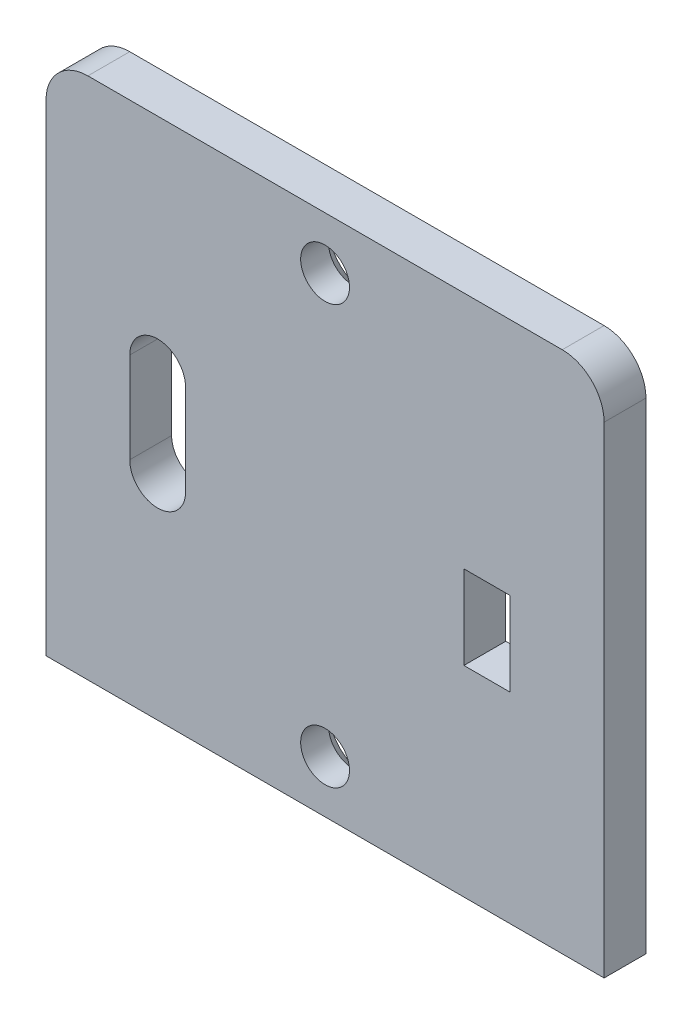
ISO-10303-21;
HEADER;
FILE_DESCRIPTION(('STEP AP214'),'2;1');
FILE_NAME('part.step','',(''),(''),'','','');
FILE_SCHEMA(('AUTOMOTIVE_DESIGN { 1 0 10303 214 1 1 1 1 }'));
ENDSEC;
DATA;
#1=APPLICATION_CONTEXT('core data for automotive mechanical design processes');
#2=APPLICATION_PROTOCOL_DEFINITION('international standard','automotive_design',2000,#1);
#3=PRODUCT_CONTEXT('',#1,'mechanical');
#4=PRODUCT('Part','Part','',(#3));
#5=PRODUCT_RELATED_PRODUCT_CATEGORY('part','',(#4));
#6=PRODUCT_DEFINITION_FORMATION('','',#4);
#7=PRODUCT_DEFINITION_CONTEXT('part definition',#1,'design');
#8=PRODUCT_DEFINITION('design','',#6,#7);
#9=PRODUCT_DEFINITION_SHAPE('','',#8);
#10=(LENGTH_UNIT() NAMED_UNIT(*) SI_UNIT(.MILLI.,.METRE.));
#11=(NAMED_UNIT(*) PLANE_ANGLE_UNIT() SI_UNIT($,.RADIAN.));
#12=(NAMED_UNIT(*) SI_UNIT($,.STERADIAN.) SOLID_ANGLE_UNIT());
#13=UNCERTAINTY_MEASURE_WITH_UNIT(LENGTH_MEASURE(1.E-05),#10,'distance_accuracy_value','');
#14=(GEOMETRIC_REPRESENTATION_CONTEXT(3) GLOBAL_UNCERTAINTY_ASSIGNED_CONTEXT((#13)) GLOBAL_UNIT_ASSIGNED_CONTEXT((#10,
#11,#12)) REPRESENTATION_CONTEXT('',''));
#15=CARTESIAN_POINT('',(0.,0.,0.));
#16=DIRECTION('',(0.,0.,1.));
#17=DIRECTION('',(1.,0.,0.));
#18=AXIS2_PLACEMENT_3D('',#15,#16,#17);
#19=CARTESIAN_POINT('',(0.,0.,3.));
#20=DIRECTION('',(0.,0.,1.));
#21=DIRECTION('',(1.,0.,0.));
#22=AXIS2_PLACEMENT_3D('',#19,#20,#21);
#23=PLANE('',#22);
#24=CARTESIAN_POINT('',(-22.738255033557,11.4519818661245,3.));
#25=DIRECTION('',(0.,0.,-1.));
#26=DIRECTION('',(-1.,0.,0.));
#27=AXIS2_PLACEMENT_3D('',#24,#25,#26);
#28=CIRCLE('',#27,2.);
#29=CARTESIAN_POINT('',(-24.738255033557,11.4519818661245,3.));
#30=VERTEX_POINT('',#29);
#31=CARTESIAN_POINT('',(-20.738255033557,11.4519818661245,3.));
#32=VERTEX_POINT('',#31);
#33=EDGE_CURVE('E144',#30,#32,#28,.T.);
#34=ORIENTED_EDGE('',*,*,#33,.T.);
#35=DIRECTION('',(0.,-1.,0.));
#36=VECTOR('',#35,1.);
#37=CARTESIAN_POINT('',(-20.738255033557,11.4519818661245,3.));
#38=LINE('',#37,#36);
#39=CARTESIAN_POINT('',(-20.738255033557,4.95198186612454,3.));
#40=VERTEX_POINT('',#39);
#41=EDGE_CURVE('E155',#32,#40,#38,.T.);
#42=ORIENTED_EDGE('',*,*,#41,.T.);
#43=CARTESIAN_POINT('',(-22.738255033557,4.95198186612454,3.));
#44=DIRECTION('',(0.,0.,-1.));
#45=DIRECTION('',(-1.,0.,0.));
#46=AXIS2_PLACEMENT_3D('',#43,#44,#45);
#47=CIRCLE('',#46,2.);
#48=CARTESIAN_POINT('',(-24.738255033557,4.95198186612454,3.));
#49=VERTEX_POINT('',#48);
#50=EDGE_CURVE('E54',#40,#49,#47,.T.);
#51=ORIENTED_EDGE('',*,*,#50,.T.);
#52=DIRECTION('',(0.,1.,0.));
#53=VECTOR('',#52,1.);
#54=CARTESIAN_POINT('',(-24.738255033557,11.4519818661245,3.));
#55=LINE('',#54,#53);
#56=EDGE_CURVE('E152',#49,#30,#55,.T.);
#57=ORIENTED_EDGE('',*,*,#56,.T.);
#58=EDGE_LOOP('',(#34,#42,#51,#57));
#59=FACE_BOUND('',#58,.T.);
#60=DIRECTION('',(0.,-1.,0.));
#61=VECTOR('',#60,1.);
#62=CARTESIAN_POINT('',(2.5106810935728,10.1581158120587,3.));
#63=LINE('',#62,#61);
#64=CARTESIAN_POINT('',(2.5106810935728,10.1581158120587,3.));
#65=VERTEX_POINT('',#64);
#66=CARTESIAN_POINT('',(2.5106810935728,4.15811581205871,3.));
#67=VERTEX_POINT('',#66);
#68=EDGE_CURVE('E198',#65,#67,#63,.T.);
#69=ORIENTED_EDGE('',*,*,#68,.T.);
#70=DIRECTION('',(-1.,0.,0.));
#71=VECTOR('',#70,1.);
#72=CARTESIAN_POINT('',(2.5106810935728,4.15811581205871,3.));
#73=LINE('',#72,#71);
#74=CARTESIAN_POINT('',(-0.789318906427197,4.15811581205871,3.));
#75=VERTEX_POINT('',#74);
#76=EDGE_CURVE('E208',#67,#75,#73,.T.);
#77=ORIENTED_EDGE('',*,*,#76,.T.);
#78=DIRECTION('',(0.,1.,0.));
#79=VECTOR('',#78,1.);
#80=CARTESIAN_POINT('',(-0.789318906427196,10.1581158120587,3.));
#81=LINE('',#80,#79);
#82=CARTESIAN_POINT('',(-0.789318906427196,10.1581158120587,3.));
#83=VERTEX_POINT('',#82);
#84=EDGE_CURVE('E62',#75,#83,#81,.T.);
#85=ORIENTED_EDGE('',*,*,#84,.T.);
#86=DIRECTION('',(1.,0.,0.));
#87=VECTOR('',#86,1.);
#88=CARTESIAN_POINT('',(2.5106810935728,10.1581158120587,3.));
#89=LINE('',#88,#87);
#90=EDGE_CURVE('E187',#83,#65,#89,.T.);
#91=ORIENTED_EDGE('',*,*,#90,.T.);
#92=EDGE_LOOP('',(#69,#77,#85,#91));
#93=FACE_BOUND('',#92,.T.);
#94=CARTESIAN_POINT('',(-10.738255033557,-6.46812080536913,3.));
#95=DIRECTION('',(0.,0.,1.));
#96=DIRECTION('',(1.,0.,0.));
#97=AXIS2_PLACEMENT_3D('',#94,#95,#96);
#98=CIRCLE('',#97,1.75);
#99=CARTESIAN_POINT('',(-8.98825503355705,-6.46812080536913,3.));
#100=VERTEX_POINT('',#99);
#101=EDGE_CURVE('E215',#100,#100,#98,.T.);
#102=ORIENTED_EDGE('',*,*,#101,.F.);
#103=EDGE_LOOP('',(#102));
#104=FACE_BOUND('',#103,.T.);
#105=DIRECTION('',(-1.,0.,0.));
#106=VECTOR('',#105,1.);
#107=CARTESIAN_POINT('',(-30.738255033557,27.2818791946309,3.));
#108=LINE('',#107,#106);
#109=CARTESIAN_POINT('',(6.26174496644295,27.2818791946309,3.));
#110=VERTEX_POINT('',#109);
#111=CARTESIAN_POINT('',(-27.738255033557,27.2818791946309,3.));
#112=VERTEX_POINT('',#111);
#113=EDGE_CURVE('E222',#110,#112,#108,.T.);
#114=ORIENTED_EDGE('',*,*,#113,.T.);
#115=CARTESIAN_POINT('',(-27.738255033557,24.2818791946309,3.));
#116=DIRECTION('',(0.,0.,1.));
#117=DIRECTION('',(1.,0.,0.));
#118=AXIS2_PLACEMENT_3D('',#115,#116,#117);
#119=CIRCLE('',#118,3.);
#120=CARTESIAN_POINT('',(-30.738255033557,24.2818791946309,3.));
#121=VERTEX_POINT('',#120);
#122=EDGE_CURVE('E270',#112,#121,#119,.T.);
#123=ORIENTED_EDGE('',*,*,#122,.T.);
#124=DIRECTION('',(0.,-1.,0.));
#125=VECTOR('',#124,1.);
#126=CARTESIAN_POINT('',(-30.738255033557,27.2818791946309,3.));
#127=LINE('',#126,#125);
#128=CARTESIAN_POINT('',(-30.738255033557,-10.2181208053691,3.));
#129=VERTEX_POINT('',#128);
#130=EDGE_CURVE('E226',#121,#129,#127,.T.);
#131=ORIENTED_EDGE('',*,*,#130,.T.);
#132=DIRECTION('',(1.,0.,0.));
#133=VECTOR('',#132,1.);
#134=CARTESIAN_POINT('',(-30.738255033557,-10.2181208053691,3.));
#135=LINE('',#134,#133);
#136=CARTESIAN_POINT('',(9.26174496644296,-10.2181208053691,3.));
#137=VERTEX_POINT('',#136);
#138=EDGE_CURVE('E228',#129,#137,#135,.T.);
#139=ORIENTED_EDGE('',*,*,#138,.T.);
#140=DIRECTION('',(0.,1.,0.));
#141=VECTOR('',#140,1.);
#142=CARTESIAN_POINT('',(9.26174496644295,27.2818791946309,3.));
#143=LINE('',#142,#141);
#144=CARTESIAN_POINT('',(9.26174496644295,24.2818791946309,3.));
#145=VERTEX_POINT('',#144);
#146=EDGE_CURVE('E219',#137,#145,#143,.T.);
#147=ORIENTED_EDGE('',*,*,#146,.T.);
#148=CARTESIAN_POINT('',(6.26174496644295,24.2818791946309,3.));
#149=DIRECTION('',(0.,0.,1.));
#150=DIRECTION('',(1.,0.,0.));
#151=AXIS2_PLACEMENT_3D('',#148,#149,#150);
#152=CIRCLE('',#151,3.);
#153=EDGE_CURVE('E268',#145,#110,#152,.T.);
#154=ORIENTED_EDGE('',*,*,#153,.T.);
#155=EDGE_LOOP('',(#114,#123,#131,#139,#147,#154));
#156=FACE_BOUND('',#155,.T.);
#157=CARTESIAN_POINT('',(-10.738255033557,23.5318791946309,3.));
#158=DIRECTION('',(0.,0.,1.));
#159=DIRECTION('',(1.,0.,0.));
#160=AXIS2_PLACEMENT_3D('',#157,#158,#159);
#161=CIRCLE('',#160,1.75);
#162=CARTESIAN_POINT('',(-8.98825503355705,23.5318791946309,3.));
#163=VERTEX_POINT('',#162);
#164=EDGE_CURVE('E180',#163,#163,#161,.T.);
#165=ORIENTED_EDGE('',*,*,#164,.F.);
#166=EDGE_LOOP('',(#165));
#167=FACE_BOUND('',#166,.T.);
#168=ADVANCED_FACE('F39',(#59,#93,#104,#156,#167),#23,.T.);
#169=CARTESIAN_POINT('',(0.,0.,0.));
#170=DIRECTION('',(0.,0.,1.));
#171=DIRECTION('',(1.,0.,0.));
#172=AXIS2_PLACEMENT_3D('',#169,#170,#171);
#173=PLANE('',#172);
#174=CARTESIAN_POINT('',(0.860681093572804,15.1581158120587,0.));
#175=DIRECTION('',(0.,0.,1.));
#176=DIRECTION('',(1.,0.,0.));
#177=AXIS2_PLACEMENT_3D('',#174,#175,#176);
#178=CIRCLE('',#177,1.);
#179=CARTESIAN_POINT('',(1.8606810935728,15.1581158120587,0.));
#180=VERTEX_POINT('',#179);
#181=EDGE_CURVE('E11',#180,#180,#178,.F.);
#182=ORIENTED_EDGE('',*,*,#181,.F.);
#183=EDGE_LOOP('',(#182));
#184=FACE_BOUND('',#183,.T.);
#185=CARTESIAN_POINT('',(0.860681093572802,-0.841884187941289,0.));
#186=DIRECTION('',(0.,0.,1.));
#187=DIRECTION('',(1.,0.,0.));
#188=AXIS2_PLACEMENT_3D('',#185,#186,#187);
#189=CIRCLE('',#188,1.);
#190=CARTESIAN_POINT('',(1.8606810935728,-0.841884187941289,0.));
#191=VERTEX_POINT('',#190);
#192=EDGE_CURVE('E47',#191,#191,#189,.F.);
#193=ORIENTED_EDGE('',*,*,#192,.F.);
#194=EDGE_LOOP('',(#193));
#195=FACE_BOUND('',#194,.T.);
#196=DIRECTION('',(0.,-1.,0.));
#197=VECTOR('',#196,1.);
#198=CARTESIAN_POINT('',(-20.738255033557,11.4519818661245,0.));
#199=LINE('',#198,#197);
#200=CARTESIAN_POINT('',(-20.738255033557,11.4519818661245,0.));
#201=VERTEX_POINT('',#200);
#202=CARTESIAN_POINT('',(-20.738255033557,4.95198186612454,0.));
#203=VERTEX_POINT('',#202);
#204=EDGE_CURVE('E173',#201,#203,#199,.T.);
#205=ORIENTED_EDGE('',*,*,#204,.F.);
#206=CARTESIAN_POINT('',(-22.738255033557,11.4519818661245,0.));
#207=DIRECTION('',(0.,0.,-1.));
#208=DIRECTION('',(-1.,0.,0.));
#209=AXIS2_PLACEMENT_3D('',#206,#207,#208);
#210=CIRCLE('',#209,2.);
#211=CARTESIAN_POINT('',(-24.738255033557,11.4519818661245,0.));
#212=VERTEX_POINT('',#211);
#213=EDGE_CURVE('E147',#212,#201,#210,.T.);
#214=ORIENTED_EDGE('',*,*,#213,.F.);
#215=DIRECTION('',(0.,1.,0.));
#216=VECTOR('',#215,1.);
#217=CARTESIAN_POINT('',(-24.738255033557,11.4519818661245,0.));
#218=LINE('',#217,#216);
#219=CARTESIAN_POINT('',(-24.738255033557,4.95198186612454,0.));
#220=VERTEX_POINT('',#219);
#221=EDGE_CURVE('E161',#220,#212,#218,.T.);
#222=ORIENTED_EDGE('',*,*,#221,.F.);
#223=CARTESIAN_POINT('',(-22.738255033557,4.95198186612454,0.));
#224=DIRECTION('',(0.,0.,-1.));
#225=DIRECTION('',(-1.,0.,0.));
#226=AXIS2_PLACEMENT_3D('',#223,#224,#225);
#227=CIRCLE('',#226,2.);
#228=EDGE_CURVE('E164',#203,#220,#227,.T.);
#229=ORIENTED_EDGE('',*,*,#228,.F.);
#230=EDGE_LOOP('',(#205,#214,#222,#229));
#231=FACE_BOUND('',#230,.T.);
#232=DIRECTION('',(-1.,0.,0.));
#233=VECTOR('',#232,1.);
#234=CARTESIAN_POINT('',(2.5106810935728,4.15811581205871,0.));
#235=LINE('',#234,#233);
#236=CARTESIAN_POINT('',(2.5106810935728,4.15811581205871,0.));
#237=VERTEX_POINT('',#236);
#238=CARTESIAN_POINT('',(-0.789318906427197,4.15811581205871,0.));
#239=VERTEX_POINT('',#238);
#240=EDGE_CURVE('E201',#237,#239,#235,.T.);
#241=ORIENTED_EDGE('',*,*,#240,.F.);
#242=DIRECTION('',(0.,-1.,0.));
#243=VECTOR('',#242,1.);
#244=CARTESIAN_POINT('',(2.5106810935728,10.1581158120587,0.));
#245=LINE('',#244,#243);
#246=CARTESIAN_POINT('',(2.5106810935728,10.1581158120587,0.));
#247=VERTEX_POINT('',#246);
#248=EDGE_CURVE('E174',#247,#237,#245,.T.);
#249=ORIENTED_EDGE('',*,*,#248,.F.);
#250=DIRECTION('',(1.,0.,0.));
#251=VECTOR('',#250,1.);
#252=CARTESIAN_POINT('',(2.5106810935728,10.1581158120587,0.));
#253=LINE('',#252,#251);
#254=CARTESIAN_POINT('',(-0.789318906427196,10.1581158120587,0.));
#255=VERTEX_POINT('',#254);
#256=EDGE_CURVE('E194',#255,#247,#253,.T.);
#257=ORIENTED_EDGE('',*,*,#256,.F.);
#258=DIRECTION('',(0.,1.,0.));
#259=VECTOR('',#258,1.);
#260=CARTESIAN_POINT('',(-0.789318906427196,10.1581158120587,0.));
#261=LINE('',#260,#259);
#262=EDGE_CURVE('E197',#239,#255,#261,.T.);
#263=ORIENTED_EDGE('',*,*,#262,.F.);
#264=EDGE_LOOP('',(#241,#249,#257,#263));
#265=FACE_BOUND('',#264,.T.);
#266=CARTESIAN_POINT('',(-10.738255033557,-6.46812080536913,0.));
#267=DIRECTION('',(0.,0.,1.));
#268=DIRECTION('',(1.,0.,0.));
#269=AXIS2_PLACEMENT_3D('',#266,#267,#268);
#270=CIRCLE('',#269,2.75);
#271=CARTESIAN_POINT('',(-7.98825503355705,-6.46812080536913,0.));
#272=VERTEX_POINT('',#271);
#273=EDGE_CURVE('E247',#272,#272,#270,.T.);
#274=ORIENTED_EDGE('',*,*,#273,.T.);
#275=EDGE_LOOP('',(#274));
#276=FACE_BOUND('',#275,.T.);
#277=CARTESIAN_POINT('',(-10.738255033557,23.5318791946309,0.));
#278=DIRECTION('',(0.,0.,1.));
#279=DIRECTION('',(1.,0.,0.));
#280=AXIS2_PLACEMENT_3D('',#277,#278,#279);
#281=CIRCLE('',#280,2.75);
#282=CARTESIAN_POINT('',(-7.98825503355705,23.5318791946309,0.));
#283=VERTEX_POINT('',#282);
#284=EDGE_CURVE('E244',#283,#283,#281,.T.);
#285=ORIENTED_EDGE('',*,*,#284,.T.);
#286=EDGE_LOOP('',(#285));
#287=FACE_BOUND('',#286,.T.);
#288=DIRECTION('',(0.,-1.,0.));
#289=VECTOR('',#288,1.);
#290=CARTESIAN_POINT('',(-30.738255033557,27.2818791946309,0.));
#291=LINE('',#290,#289);
#292=CARTESIAN_POINT('',(-30.738255033557,24.2818791946309,0.));
#293=VERTEX_POINT('',#292);
#294=CARTESIAN_POINT('',(-30.738255033557,-10.2181208053691,0.));
#295=VERTEX_POINT('',#294);
#296=EDGE_CURVE('E236',#293,#295,#291,.T.);
#297=ORIENTED_EDGE('',*,*,#296,.F.);
#298=CARTESIAN_POINT('',(-27.738255033557,24.2818791946309,0.));
#299=DIRECTION('',(0.,0.,1.));
#300=DIRECTION('',(1.,0.,0.));
#301=AXIS2_PLACEMENT_3D('',#298,#299,#300);
#302=CIRCLE('',#301,3.);
#303=CARTESIAN_POINT('',(-27.738255033557,27.2818791946309,0.));
#304=VERTEX_POINT('',#303);
#305=EDGE_CURVE('E261',#293,#304,#302,.F.);
#306=ORIENTED_EDGE('',*,*,#305,.T.);
#307=DIRECTION('',(-1.,0.,0.));
#308=VECTOR('',#307,1.);
#309=CARTESIAN_POINT('',(-30.738255033557,27.2818791946309,0.));
#310=LINE('',#309,#308);
#311=CARTESIAN_POINT('',(6.26174496644295,27.2818791946309,0.));
#312=VERTEX_POINT('',#311);
#313=EDGE_CURVE('E233',#312,#304,#310,.T.);
#314=ORIENTED_EDGE('',*,*,#313,.F.);
#315=CARTESIAN_POINT('',(6.26174496644295,24.2818791946309,0.));
#316=DIRECTION('',(0.,0.,1.));
#317=DIRECTION('',(1.,0.,0.));
#318=AXIS2_PLACEMENT_3D('',#315,#316,#317);
#319=CIRCLE('',#318,3.);
#320=CARTESIAN_POINT('',(9.26174496644295,24.2818791946309,0.));
#321=VERTEX_POINT('',#320);
#322=EDGE_CURVE('E259',#312,#321,#319,.F.);
#323=ORIENTED_EDGE('',*,*,#322,.T.);
#324=DIRECTION('',(0.,1.,0.));
#325=VECTOR('',#324,1.);
#326=CARTESIAN_POINT('',(9.26174496644295,27.2818791946309,0.));
#327=LINE('',#326,#325);
#328=CARTESIAN_POINT('',(9.26174496644296,-10.2181208053691,0.));
#329=VERTEX_POINT('',#328);
#330=EDGE_CURVE('E218',#329,#321,#327,.T.);
#331=ORIENTED_EDGE('',*,*,#330,.F.);
#332=DIRECTION('',(1.,0.,0.));
#333=VECTOR('',#332,1.);
#334=CARTESIAN_POINT('',(-30.738255033557,-10.2181208053691,0.));
#335=LINE('',#334,#333);
#336=EDGE_CURVE('E223',#295,#329,#335,.T.);
#337=ORIENTED_EDGE('',*,*,#336,.F.);
#338=EDGE_LOOP('',(#297,#306,#314,#323,#331,#337));
#339=FACE_BOUND('',#338,.T.);
#340=ADVANCED_FACE('F278',(#184,#195,#231,#265,#276,#287,#339),#173,.F.);
#341=CARTESIAN_POINT('',(9.26174496644295,27.2818791946309,3.));
#342=DIRECTION('',(-1.,0.,0.));
#343=DIRECTION('',(0.,-1.,0.));
#344=AXIS2_PLACEMENT_3D('',#341,#342,#343);
#345=PLANE('',#344);
#346=ORIENTED_EDGE('',*,*,#330,.T.);
#347=DIRECTION('',(0.,0.,-1.));
#348=VECTOR('',#347,1.);
#349=CARTESIAN_POINT('',(9.26174496644295,24.2818791946309,3.));
#350=LINE('',#349,#348);
#351=EDGE_CURVE('E272',#321,#145,#350,.F.);
#352=ORIENTED_EDGE('',*,*,#351,.T.);
#353=ORIENTED_EDGE('',*,*,#146,.F.);
#354=DIRECTION('',(0.,0.,-1.));
#355=VECTOR('',#354,1.);
#356=CARTESIAN_POINT('',(9.26174496644296,-10.2181208053691,3.));
#357=LINE('',#356,#355);
#358=EDGE_CURVE('E230',#137,#329,#357,.T.);
#359=ORIENTED_EDGE('',*,*,#358,.T.);
#360=EDGE_LOOP('',(#346,#352,#353,#359));
#361=FACE_BOUND('',#360,.T.);
#362=ADVANCED_FACE('F281',(#361),#345,.F.);
#363=CARTESIAN_POINT('',(-30.738255033557,27.2818791946309,3.));
#364=DIRECTION('',(0.,-1.,0.));
#365=DIRECTION('',(0.,0.,-1.));
#366=AXIS2_PLACEMENT_3D('',#363,#364,#365);
#367=PLANE('',#366);
#368=ORIENTED_EDGE('',*,*,#313,.T.);
#369=DIRECTION('',(0.,0.,-1.));
#370=VECTOR('',#369,1.);
#371=CARTESIAN_POINT('',(-27.738255033557,27.2818791946309,3.));
#372=LINE('',#371,#370);
#373=EDGE_CURVE('E266',#304,#112,#372,.F.);
#374=ORIENTED_EDGE('',*,*,#373,.T.);
#375=ORIENTED_EDGE('',*,*,#113,.F.);
#376=DIRECTION('',(0.,0.,-1.));
#377=VECTOR('',#376,1.);
#378=CARTESIAN_POINT('',(6.26174496644295,27.2818791946309,3.));
#379=LINE('',#378,#377);
#380=EDGE_CURVE('E263',#110,#312,#379,.T.);
#381=ORIENTED_EDGE('',*,*,#380,.T.);
#382=EDGE_LOOP('',(#368,#374,#375,#381));
#383=FACE_BOUND('',#382,.T.);
#384=ADVANCED_FACE('F317',(#383),#367,.F.);
#385=CARTESIAN_POINT('',(-30.738255033557,27.2818791946309,3.));
#386=DIRECTION('',(1.,0.,0.));
#387=DIRECTION('',(0.,0.,-1.));
#388=AXIS2_PLACEMENT_3D('',#385,#386,#387);
#389=PLANE('',#388);
#390=ORIENTED_EDGE('',*,*,#130,.F.);
#391=DIRECTION('',(0.,0.,-1.));
#392=VECTOR('',#391,1.);
#393=CARTESIAN_POINT('',(-30.738255033557,24.2818791946309,3.));
#394=LINE('',#393,#392);
#395=EDGE_CURVE('E256',#121,#293,#394,.T.);
#396=ORIENTED_EDGE('',*,*,#395,.T.);
#397=ORIENTED_EDGE('',*,*,#296,.T.);
#398=DIRECTION('',(0.,0.,-1.));
#399=VECTOR('',#398,1.);
#400=CARTESIAN_POINT('',(-30.738255033557,-10.2181208053691,3.));
#401=LINE('',#400,#399);
#402=EDGE_CURVE('E241',#129,#295,#401,.T.);
#403=ORIENTED_EDGE('',*,*,#402,.F.);
#404=EDGE_LOOP('',(#390,#396,#397,#403));
#405=FACE_BOUND('',#404,.T.);
#406=ADVANCED_FACE('F301',(#405),#389,.F.);
#407=CARTESIAN_POINT('',(-30.738255033557,-10.2181208053691,3.));
#408=DIRECTION('',(0.,1.,0.));
#409=DIRECTION('',(0.,0.,1.));
#410=AXIS2_PLACEMENT_3D('',#407,#408,#409);
#411=PLANE('',#410);
#412=ORIENTED_EDGE('',*,*,#336,.T.);
#413=ORIENTED_EDGE('',*,*,#358,.F.);
#414=ORIENTED_EDGE('',*,*,#138,.F.);
#415=ORIENTED_EDGE('',*,*,#402,.T.);
#416=EDGE_LOOP('',(#412,#413,#414,#415));
#417=FACE_BOUND('',#416,.T.);
#418=ADVANCED_FACE('F305',(#417),#411,.F.);
#419=CARTESIAN_POINT('',(-10.738255033557,-6.46812080536913,3.));
#420=DIRECTION('',(0.,0.,-1.));
#421=DIRECTION('',(-1.,0.,0.));
#422=AXIS2_PLACEMENT_3D('',#419,#420,#421);
#423=CYLINDRICAL_SURFACE('',#422,1.75);
#424=CARTESIAN_POINT('',(-10.738255033557,-6.46812080536913,1.));
#425=DIRECTION('',(0.,0.,1.));
#426=DIRECTION('',(1.,0.,0.));
#427=AXIS2_PLACEMENT_3D('',#424,#425,#426);
#428=CIRCLE('',#427,1.75);
#429=CARTESIAN_POINT('',(-8.98825503355705,-6.46812080536913,1.));
#430=VERTEX_POINT('',#429);
#431=EDGE_CURVE('E250',#430,#430,#428,.F.);
#432=ORIENTED_EDGE('',*,*,#431,.T.);
#433=EDGE_LOOP('',(#432));
#434=FACE_BOUND('',#433,.T.);
#435=ORIENTED_EDGE('',*,*,#101,.T.);
#436=EDGE_LOOP('',(#435));
#437=FACE_BOUND('',#436,.T.);
#438=ADVANCED_FACE('F334',(#434,#437),#423,.F.);
#439=CARTESIAN_POINT('',(-10.738255033557,23.5318791946309,3.));
#440=DIRECTION('',(0.,0.,-1.));
#441=DIRECTION('',(-1.,0.,0.));
#442=AXIS2_PLACEMENT_3D('',#439,#440,#441);
#443=CYLINDRICAL_SURFACE('',#442,1.75);
#444=CARTESIAN_POINT('',(-10.738255033557,23.5318791946309,1.00000000000001));
#445=DIRECTION('',(0.,0.,1.));
#446=DIRECTION('',(1.,0.,0.));
#447=AXIS2_PLACEMENT_3D('',#444,#445,#446);
#448=CIRCLE('',#447,1.75);
#449=CARTESIAN_POINT('',(-8.98825503355705,23.5318791946309,1.00000000000001));
#450=VERTEX_POINT('',#449);
#451=EDGE_CURVE('E253',#450,#450,#448,.F.);
#452=ORIENTED_EDGE('',*,*,#451,.T.);
#453=EDGE_LOOP('',(#452));
#454=FACE_BOUND('',#453,.T.);
#455=ORIENTED_EDGE('',*,*,#164,.T.);
#456=EDGE_LOOP('',(#455));
#457=FACE_BOUND('',#456,.T.);
#458=ADVANCED_FACE('F355',(#454,#457),#443,.F.);
#459=CARTESIAN_POINT('',(-10.738255033557,-6.46812080536913,0.));
#460=DIRECTION('',(0.,0.,-1.));
#461=DIRECTION('',(-1.,0.,0.));
#462=AXIS2_PLACEMENT_3D('',#459,#460,#461);
#463=CONICAL_SURFACE('',#462,2.75,0.785398163397444);
#464=ORIENTED_EDGE('',*,*,#431,.F.);
#465=EDGE_LOOP('',(#464));
#466=FACE_BOUND('',#465,.T.);
#467=ORIENTED_EDGE('',*,*,#273,.F.);
#468=EDGE_LOOP('',(#467));
#469=FACE_BOUND('',#468,.T.);
#470=ADVANCED_FACE('F362',(#466,#469),#463,.F.);
#471=CARTESIAN_POINT('',(-10.738255033557,23.5318791946309,0.));
#472=DIRECTION('',(0.,0.,-1.));
#473=DIRECTION('',(-1.,0.,0.));
#474=AXIS2_PLACEMENT_3D('',#471,#472,#473);
#475=CONICAL_SURFACE('',#474,2.75,0.785398163397445);
#476=ORIENTED_EDGE('',*,*,#451,.F.);
#477=EDGE_LOOP('',(#476));
#478=FACE_BOUND('',#477,.T.);
#479=ORIENTED_EDGE('',*,*,#284,.F.);
#480=EDGE_LOOP('',(#479));
#481=FACE_BOUND('',#480,.T.);
#482=ADVANCED_FACE('F369',(#478,#481),#475,.F.);
#483=CARTESIAN_POINT('',(-27.738255033557,24.2818791946309,3.));
#484=DIRECTION('',(0.,0.,-1.));
#485=DIRECTION('',(-1.,0.,0.));
#486=AXIS2_PLACEMENT_3D('',#483,#484,#485);
#487=CYLINDRICAL_SURFACE('',#486,3.);
#488=ORIENTED_EDGE('',*,*,#122,.F.);
#489=ORIENTED_EDGE('',*,*,#373,.F.);
#490=ORIENTED_EDGE('',*,*,#305,.F.);
#491=ORIENTED_EDGE('',*,*,#395,.F.);
#492=EDGE_LOOP('',(#488,#489,#490,#491));
#493=FACE_BOUND('',#492,.T.);
#494=ADVANCED_FACE('F313',(#493),#487,.T.);
#495=CARTESIAN_POINT('',(6.26174496644295,24.2818791946309,3.));
#496=DIRECTION('',(0.,0.,-1.));
#497=DIRECTION('',(-1.,0.,0.));
#498=AXIS2_PLACEMENT_3D('',#495,#496,#497);
#499=CYLINDRICAL_SURFACE('',#498,3.);
#500=ORIENTED_EDGE('',*,*,#153,.F.);
#501=ORIENTED_EDGE('',*,*,#351,.F.);
#502=ORIENTED_EDGE('',*,*,#322,.F.);
#503=ORIENTED_EDGE('',*,*,#380,.F.);
#504=EDGE_LOOP('',(#500,#501,#502,#503));
#505=FACE_BOUND('',#504,.T.);
#506=ADVANCED_FACE('F41',(#505),#499,.T.);
#507=CARTESIAN_POINT('',(2.5106810935728,10.1581158120587,3.));
#508=DIRECTION('',(1.,0.,0.));
#509=DIRECTION('',(0.,1.,0.));
#510=AXIS2_PLACEMENT_3D('',#507,#508,#509);
#511=PLANE('',#510);
#512=ORIENTED_EDGE('',*,*,#248,.T.);
#513=DIRECTION('',(0.,0.,-1.));
#514=VECTOR('',#513,1.);
#515=CARTESIAN_POINT('',(2.5106810935728,4.15811581205871,3.));
#516=LINE('',#515,#514);
#517=EDGE_CURVE('E184',#67,#237,#516,.T.);
#518=ORIENTED_EDGE('',*,*,#517,.F.);
#519=ORIENTED_EDGE('',*,*,#68,.F.);
#520=DIRECTION('',(0.,0.,-1.));
#521=VECTOR('',#520,1.);
#522=CARTESIAN_POINT('',(2.5106810935728,10.1581158120587,3.));
#523=LINE('',#522,#521);
#524=EDGE_CURVE('E192',#65,#247,#523,.T.);
#525=ORIENTED_EDGE('',*,*,#524,.T.);
#526=EDGE_LOOP('',(#512,#518,#519,#525));
#527=FACE_BOUND('',#526,.T.);
#528=ADVANCED_FACE('F387',(#527),#511,.F.);
#529=CARTESIAN_POINT('',(2.5106810935728,10.1581158120587,3.));
#530=DIRECTION('',(0.,1.,0.));
#531=DIRECTION('',(0.,0.,1.));
#532=AXIS2_PLACEMENT_3D('',#529,#530,#531);
#533=PLANE('',#532);
#534=ORIENTED_EDGE('',*,*,#256,.T.);
#535=ORIENTED_EDGE('',*,*,#524,.F.);
#536=ORIENTED_EDGE('',*,*,#90,.F.);
#537=DIRECTION('',(0.,0.,-1.));
#538=VECTOR('',#537,1.);
#539=CARTESIAN_POINT('',(-0.789318906427196,10.1581158120587,3.));
#540=LINE('',#539,#538);
#541=EDGE_CURVE('E190',#83,#255,#540,.T.);
#542=ORIENTED_EDGE('',*,*,#541,.T.);
#543=EDGE_LOOP('',(#534,#535,#536,#542));
#544=FACE_BOUND('',#543,.T.);
#545=ADVANCED_FACE('F393',(#544),#533,.F.);
#546=CARTESIAN_POINT('',(-0.789318906427196,10.1581158120587,3.));
#547=DIRECTION('',(-1.,0.,0.));
#548=DIRECTION('',(0.,-1.,0.));
#549=AXIS2_PLACEMENT_3D('',#546,#547,#548);
#550=PLANE('',#549);
#551=ORIENTED_EDGE('',*,*,#262,.T.);
#552=ORIENTED_EDGE('',*,*,#541,.F.);
#553=ORIENTED_EDGE('',*,*,#84,.F.);
#554=DIRECTION('',(0.,0.,-1.));
#555=VECTOR('',#554,1.);
#556=CARTESIAN_POINT('',(-0.789318906427197,4.15811581205871,3.));
#557=LINE('',#556,#555);
#558=EDGE_CURVE('E188',#75,#239,#557,.T.);
#559=ORIENTED_EDGE('',*,*,#558,.T.);
#560=EDGE_LOOP('',(#551,#552,#553,#559));
#561=FACE_BOUND('',#560,.T.);
#562=ADVANCED_FACE('F401',(#561),#550,.F.);
#563=CARTESIAN_POINT('',(2.5106810935728,4.15811581205871,3.));
#564=DIRECTION('',(0.,-1.,0.));
#565=DIRECTION('',(0.,0.,-1.));
#566=AXIS2_PLACEMENT_3D('',#563,#564,#565);
#567=PLANE('',#566);
#568=ORIENTED_EDGE('',*,*,#240,.T.);
#569=ORIENTED_EDGE('',*,*,#558,.F.);
#570=ORIENTED_EDGE('',*,*,#76,.F.);
#571=ORIENTED_EDGE('',*,*,#517,.T.);
#572=EDGE_LOOP('',(#568,#569,#570,#571));
#573=FACE_BOUND('',#572,.T.);
#574=ADVANCED_FACE('F409',(#573),#567,.F.);
#575=CARTESIAN_POINT('',(-22.738255033557,11.4519818661245,3.));
#576=DIRECTION('',(0.,0.,-1.));
#577=DIRECTION('',(-1.,0.,0.));
#578=AXIS2_PLACEMENT_3D('',#575,#576,#577);
#579=CYLINDRICAL_SURFACE('',#578,2.);
#580=ORIENTED_EDGE('',*,*,#213,.T.);
#581=DIRECTION('',(0.,0.,-1.));
#582=VECTOR('',#581,1.);
#583=CARTESIAN_POINT('',(-20.738255033557,11.4519818661245,3.));
#584=LINE('',#583,#582);
#585=EDGE_CURVE('E140',#32,#201,#584,.T.);
#586=ORIENTED_EDGE('',*,*,#585,.F.);
#587=ORIENTED_EDGE('',*,*,#33,.F.);
#588=DIRECTION('',(0.,0.,-1.));
#589=VECTOR('',#588,1.);
#590=CARTESIAN_POINT('',(-24.738255033557,11.4519818661245,3.));
#591=LINE('',#590,#589);
#592=EDGE_CURVE('E178',#30,#212,#591,.T.);
#593=ORIENTED_EDGE('',*,*,#592,.T.);
#594=EDGE_LOOP('',(#580,#586,#587,#593));
#595=FACE_BOUND('',#594,.T.);
#596=ADVANCED_FACE('F142',(#595),#579,.F.);
#597=CARTESIAN_POINT('',(-24.738255033557,11.4519818661245,3.));
#598=DIRECTION('',(-1.,0.,0.));
#599=DIRECTION('',(0.,0.,1.));
#600=AXIS2_PLACEMENT_3D('',#597,#598,#599);
#601=PLANE('',#600);
#602=ORIENTED_EDGE('',*,*,#221,.T.);
#603=ORIENTED_EDGE('',*,*,#592,.F.);
#604=ORIENTED_EDGE('',*,*,#56,.F.);
#605=DIRECTION('',(0.,0.,-1.));
#606=VECTOR('',#605,1.);
#607=CARTESIAN_POINT('',(-24.738255033557,4.95198186612454,3.));
#608=LINE('',#607,#606);
#609=EDGE_CURVE('E181',#49,#220,#608,.T.);
#610=ORIENTED_EDGE('',*,*,#609,.T.);
#611=EDGE_LOOP('',(#602,#603,#604,#610));
#612=FACE_BOUND('',#611,.T.);
#613=ADVANCED_FACE('F423',(#612),#601,.F.);
#614=CARTESIAN_POINT('',(-22.738255033557,4.95198186612454,3.));
#615=DIRECTION('',(0.,0.,-1.));
#616=DIRECTION('',(-1.,0.,0.));
#617=AXIS2_PLACEMENT_3D('',#614,#615,#616);
#618=CYLINDRICAL_SURFACE('',#617,2.);
#619=ORIENTED_EDGE('',*,*,#228,.T.);
#620=ORIENTED_EDGE('',*,*,#609,.F.);
#621=ORIENTED_EDGE('',*,*,#50,.F.);
#622=DIRECTION('',(0.,0.,-1.));
#623=VECTOR('',#622,1.);
#624=CARTESIAN_POINT('',(-20.738255033557,4.95198186612454,3.));
#625=LINE('',#624,#623);
#626=EDGE_CURVE('E151',#40,#203,#625,.T.);
#627=ORIENTED_EDGE('',*,*,#626,.T.);
#628=EDGE_LOOP('',(#619,#620,#621,#627));
#629=FACE_BOUND('',#628,.T.);
#630=ADVANCED_FACE('F430',(#629),#618,.F.);
#631=CARTESIAN_POINT('',(-20.738255033557,11.4519818661245,3.));
#632=DIRECTION('',(1.,0.,0.));
#633=DIRECTION('',(0.,0.,-1.));
#634=AXIS2_PLACEMENT_3D('',#631,#632,#633);
#635=PLANE('',#634);
#636=ORIENTED_EDGE('',*,*,#204,.T.);
#637=ORIENTED_EDGE('',*,*,#626,.F.);
#638=ORIENTED_EDGE('',*,*,#41,.F.);
#639=ORIENTED_EDGE('',*,*,#585,.T.);
#640=EDGE_LOOP('',(#636,#637,#638,#639));
#641=FACE_BOUND('',#640,.T.);
#642=ADVANCED_FACE('F156',(#641),#635,.F.);
#643=CARTESIAN_POINT('',(0.860681093572802,-0.841884187941289,-2.));
#644=DIRECTION('',(0.,0.,1.));
#645=DIRECTION('',(1.,0.,0.));
#646=AXIS2_PLACEMENT_3D('',#643,#644,#645);
#647=CYLINDRICAL_SURFACE('',#646,1.);
#648=CARTESIAN_POINT('',(0.860681093572802,-0.841884187941289,-2.));
#649=DIRECTION('',(0.,0.,-1.));
#650=DIRECTION('',(-1.,0.,0.));
#651=AXIS2_PLACEMENT_3D('',#648,#649,#650);
#652=CIRCLE('',#651,1.);
#653=CARTESIAN_POINT('',(-0.139318906427198,-0.841884187941289,-2.));
#654=VERTEX_POINT('',#653);
#655=EDGE_CURVE('E167',#654,#654,#652,.T.);
#656=ORIENTED_EDGE('',*,*,#655,.F.);
#657=EDGE_LOOP('',(#656));
#658=FACE_BOUND('',#657,.T.);
#659=ORIENTED_EDGE('',*,*,#192,.T.);
#660=EDGE_LOOP('',(#659));
#661=FACE_BOUND('',#660,.T.);
#662=ADVANCED_FACE('F276',(#658,#661),#647,.T.);
#663=CARTESIAN_POINT('',(0.860681093572802,-0.841884187941289,-2.));
#664=DIRECTION('',(0.,0.,-1.));
#665=DIRECTION('',(-1.,0.,0.));
#666=AXIS2_PLACEMENT_3D('',#663,#664,#665);
#667=PLANE('',#666);
#668=ORIENTED_EDGE('',*,*,#655,.T.);
#669=EDGE_LOOP('',(#668));
#670=FACE_BOUND('',#669,.T.);
#671=ADVANCED_FACE('F451',(#670),#667,.T.);
#672=CARTESIAN_POINT('',(0.860681093572804,15.1581158120587,-2.));
#673=DIRECTION('',(0.,0.,1.));
#674=DIRECTION('',(1.,0.,0.));
#675=AXIS2_PLACEMENT_3D('',#672,#673,#674);
#676=CYLINDRICAL_SURFACE('',#675,1.);
#677=CARTESIAN_POINT('',(0.860681093572804,15.1581158120587,-2.));
#678=DIRECTION('',(0.,0.,-1.));
#679=DIRECTION('',(-1.,0.,0.));
#680=AXIS2_PLACEMENT_3D('',#677,#678,#679);
#681=CIRCLE('',#680,1.);
#682=CARTESIAN_POINT('',(-0.139318906427197,15.1581158120587,-2.));
#683=VERTEX_POINT('',#682);
#684=EDGE_CURVE('E585',#683,#683,#681,.T.);
#685=ORIENTED_EDGE('',*,*,#684,.F.);
#686=EDGE_LOOP('',(#685));
#687=FACE_BOUND('',#686,.T.);
#688=ORIENTED_EDGE('',*,*,#181,.T.);
#689=EDGE_LOOP('',(#688));
#690=FACE_BOUND('',#689,.T.);
#691=ADVANCED_FACE('F459',(#687,#690),#676,.T.);
#692=CARTESIAN_POINT('',(0.860681093572804,15.1581158120587,-2.));
#693=DIRECTION('',(0.,0.,-1.));
#694=DIRECTION('',(-1.,0.,0.));
#695=AXIS2_PLACEMENT_3D('',#692,#693,#694);
#696=PLANE('',#695);
#697=ORIENTED_EDGE('',*,*,#684,.T.);
#698=EDGE_LOOP('',(#697));
#699=FACE_BOUND('',#698,.T.);
#700=ADVANCED_FACE('F467',(#699),#696,.T.);
#701=CLOSED_SHELL('',(#168,#340,#362,#384,#406,#418,#438,#458,#470,#482,#494,#506,#528,#545,
#562,#574,#596,#613,#630,#642,#662,#671,#691,#700));
#702=MANIFOLD_SOLID_BREP('B2',#701);
#703=ADVANCED_BREP_SHAPE_REPRESENTATION('',(#18,#702),#14);
#704=SHAPE_DEFINITION_REPRESENTATION(#9,#703);
ENDSEC;
END-ISO-10303-21;
